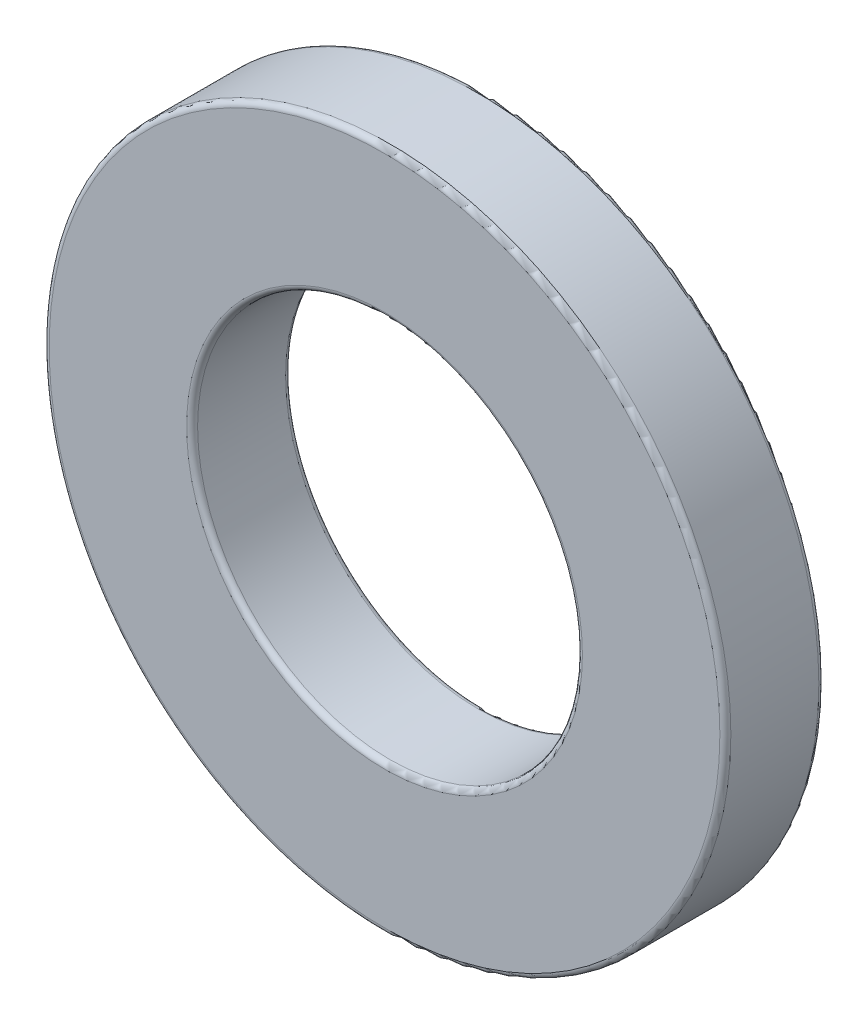
ISO-10303-21;
HEADER;
FILE_DESCRIPTION(('STEP AP214'),'2;1');
FILE_NAME('part.step','',(''),(''),'','','');
FILE_SCHEMA(('AUTOMOTIVE_DESIGN { 1 0 10303 214 1 1 1 1 }'));
ENDSEC;
DATA;
#1=APPLICATION_CONTEXT('core data for automotive mechanical design processes');
#2=APPLICATION_PROTOCOL_DEFINITION('international standard','automotive_design',2000,#1);
#3=PRODUCT_CONTEXT('',#1,'mechanical');
#4=PRODUCT('Part','Part','',(#3));
#5=PRODUCT_RELATED_PRODUCT_CATEGORY('part','',(#4));
#6=PRODUCT_DEFINITION_FORMATION('','',#4);
#7=PRODUCT_DEFINITION_CONTEXT('part definition',#1,'design');
#8=PRODUCT_DEFINITION('design','',#6,#7);
#9=PRODUCT_DEFINITION_SHAPE('','',#8);
#10=(LENGTH_UNIT() NAMED_UNIT(*) SI_UNIT(.MILLI.,.METRE.));
#11=(NAMED_UNIT(*) PLANE_ANGLE_UNIT() SI_UNIT($,.RADIAN.));
#12=(NAMED_UNIT(*) SI_UNIT($,.STERADIAN.) SOLID_ANGLE_UNIT());
#13=UNCERTAINTY_MEASURE_WITH_UNIT(LENGTH_MEASURE(1.E-05),#10,'distance_accuracy_value','');
#14=(GEOMETRIC_REPRESENTATION_CONTEXT(3) GLOBAL_UNCERTAINTY_ASSIGNED_CONTEXT((#13)) GLOBAL_UNIT_ASSIGNED_CONTEXT((#10,
#11,#12)) REPRESENTATION_CONTEXT('',''));
#15=CARTESIAN_POINT('',(0.,0.,0.));
#16=DIRECTION('',(0.,0.,1.));
#17=DIRECTION('',(1.,0.,0.));
#18=AXIS2_PLACEMENT_3D('',#15,#16,#17);
#19=CARTESIAN_POINT('',(0.,0.,9.));
#20=DIRECTION('',(0.,0.,1.));
#21=DIRECTION('',(1.,0.,0.));
#22=AXIS2_PLACEMENT_3D('',#19,#20,#21);
#23=PLANE('',#22);
#24=CARTESIAN_POINT('',(0.,0.,9.));
#25=DIRECTION('',(0.,0.,1.));
#26=DIRECTION('',(1.,0.,0.));
#27=AXIS2_PLACEMENT_3D('',#24,#25,#26);
#28=CIRCLE('',#27,30.5);
#29=CARTESIAN_POINT('',(30.5,0.,9.));
#30=VERTEX_POINT('',#29);
#31=EDGE_CURVE('E39',#30,#30,#28,.T.);
#32=ORIENTED_EDGE('',*,*,#31,.T.);
#33=EDGE_LOOP('',(#32));
#34=FACE_BOUND('',#33,.T.);
#35=CARTESIAN_POINT('',(0.,0.,9.));
#36=DIRECTION('',(0.,0.,1.));
#37=DIRECTION('',(1.,0.,0.));
#38=AXIS2_PLACEMENT_3D('',#35,#36,#37);
#39=CIRCLE('',#38,18.);
#40=CARTESIAN_POINT('',(18.,0.,9.));
#41=VERTEX_POINT('',#40);
#42=EDGE_CURVE('E43',#41,#41,#39,.F.);
#43=ORIENTED_EDGE('',*,*,#42,.T.);
#44=EDGE_LOOP('',(#43));
#45=FACE_BOUND('',#44,.T.);
#46=ADVANCED_FACE('F28',(#34,#45),#23,.T.);
#47=CARTESIAN_POINT('',(0.,0.,0.));
#48=DIRECTION('',(0.,0.,1.));
#49=DIRECTION('',(1.,0.,0.));
#50=AXIS2_PLACEMENT_3D('',#47,#48,#49);
#51=PLANE('',#50);
#52=CARTESIAN_POINT('',(0.,0.,0.));
#53=DIRECTION('',(0.,0.,1.));
#54=DIRECTION('',(1.,0.,0.));
#55=AXIS2_PLACEMENT_3D('',#52,#53,#54);
#56=CIRCLE('',#55,30.5);
#57=CARTESIAN_POINT('',(30.5,0.,0.));
#58=VERTEX_POINT('',#57);
#59=EDGE_CURVE('E48',#58,#58,#56,.F.);
#60=ORIENTED_EDGE('',*,*,#59,.T.);
#61=EDGE_LOOP('',(#60));
#62=FACE_BOUND('',#61,.T.);
#63=CARTESIAN_POINT('',(0.,0.,0.));
#64=DIRECTION('',(0.,0.,1.));
#65=DIRECTION('',(1.,0.,0.));
#66=AXIS2_PLACEMENT_3D('',#63,#64,#65);
#67=CIRCLE('',#66,18.);
#68=CARTESIAN_POINT('',(18.,0.,0.));
#69=VERTEX_POINT('',#68);
#70=EDGE_CURVE('E51',#69,#69,#67,.T.);
#71=ORIENTED_EDGE('',*,*,#70,.T.);
#72=EDGE_LOOP('',(#71));
#73=FACE_BOUND('',#72,.T.);
#74=ADVANCED_FACE('F73',(#62,#73),#51,.F.);
#75=CARTESIAN_POINT('',(0.,0.,9.));
#76=DIRECTION('',(0.,0.,-1.));
#77=DIRECTION('',(-1.,0.,0.));
#78=AXIS2_PLACEMENT_3D('',#75,#76,#77);
#79=CYLINDRICAL_SURFACE('',#78,31.);
#80=CARTESIAN_POINT('',(0.,0.,0.5));
#81=DIRECTION('',(0.,0.,1.));
#82=DIRECTION('',(1.,0.,0.));
#83=AXIS2_PLACEMENT_3D('',#80,#81,#82);
#84=CIRCLE('',#83,31.);
#85=CARTESIAN_POINT('',(31.,0.,0.5));
#86=VERTEX_POINT('',#85);
#87=EDGE_CURVE('E54',#86,#86,#84,.T.);
#88=ORIENTED_EDGE('',*,*,#87,.T.);
#89=EDGE_LOOP('',(#88));
#90=FACE_BOUND('',#89,.T.);
#91=CARTESIAN_POINT('',(0.,0.,8.5));
#92=DIRECTION('',(0.,0.,1.));
#93=DIRECTION('',(1.,0.,0.));
#94=AXIS2_PLACEMENT_3D('',#91,#92,#93);
#95=CIRCLE('',#94,31.);
#96=CARTESIAN_POINT('',(31.,0.,8.5));
#97=VERTEX_POINT('',#96);
#98=EDGE_CURVE('E57',#97,#97,#95,.F.);
#99=ORIENTED_EDGE('',*,*,#98,.T.);
#100=EDGE_LOOP('',(#99));
#101=FACE_BOUND('',#100,.T.);
#102=ADVANCED_FACE('F61',(#90,#101),#79,.T.);
#103=CARTESIAN_POINT('',(0.,0.,9.));
#104=DIRECTION('',(0.,0.,-1.));
#105=DIRECTION('',(-1.,0.,0.));
#106=AXIS2_PLACEMENT_3D('',#103,#104,#105);
#107=CYLINDRICAL_SURFACE('',#106,17.5);
#108=CARTESIAN_POINT('',(0.,0.,0.5));
#109=DIRECTION('',(0.,0.,1.));
#110=DIRECTION('',(1.,0.,0.));
#111=AXIS2_PLACEMENT_3D('',#108,#109,#110);
#112=CIRCLE('',#111,17.5);
#113=CARTESIAN_POINT('',(17.5,0.,0.5));
#114=VERTEX_POINT('',#113);
#115=EDGE_CURVE('E10',#114,#114,#112,.F.);
#116=ORIENTED_EDGE('',*,*,#115,.T.);
#117=EDGE_LOOP('',(#116));
#118=FACE_BOUND('',#117,.T.);
#119=CARTESIAN_POINT('',(0.,0.,8.5));
#120=DIRECTION('',(0.,0.,1.));
#121=DIRECTION('',(1.,0.,0.));
#122=AXIS2_PLACEMENT_3D('',#119,#120,#121);
#123=CIRCLE('',#122,17.5);
#124=CARTESIAN_POINT('',(17.5,0.,8.5));
#125=VERTEX_POINT('',#124);
#126=EDGE_CURVE('E35',#125,#125,#123,.T.);
#127=ORIENTED_EDGE('',*,*,#126,.T.);
#128=EDGE_LOOP('',(#127));
#129=FACE_BOUND('',#128,.T.);
#130=ADVANCED_FACE('F89',(#118,#129),#107,.F.);
#131=CARTESIAN_POINT('',(0.,0.,0.5));
#132=DIRECTION('',(0.,0.,1.));
#133=DIRECTION('',(1.,0.,0.));
#134=AXIS2_PLACEMENT_3D('',#131,#132,#133);
#135=TOROIDAL_SURFACE('',#134,30.5,0.5);
#136=ORIENTED_EDGE('',*,*,#59,.F.);
#137=EDGE_LOOP('',(#136));
#138=FACE_BOUND('',#137,.T.);
#139=ORIENTED_EDGE('',*,*,#87,.F.);
#140=EDGE_LOOP('',(#139));
#141=FACE_BOUND('',#140,.T.);
#142=ADVANCED_FACE('F67',(#138,#141),#135,.T.);
#143=CARTESIAN_POINT('',(0.,0.,8.5));
#144=DIRECTION('',(0.,0.,1.));
#145=DIRECTION('',(1.,0.,0.));
#146=AXIS2_PLACEMENT_3D('',#143,#144,#145);
#147=TOROIDAL_SURFACE('',#146,30.5,0.5);
#148=ORIENTED_EDGE('',*,*,#98,.F.);
#149=EDGE_LOOP('',(#148));
#150=FACE_BOUND('',#149,.T.);
#151=ORIENTED_EDGE('',*,*,#31,.F.);
#152=EDGE_LOOP('',(#151));
#153=FACE_BOUND('',#152,.T.);
#154=ADVANCED_FACE('F63',(#150,#153),#147,.T.);
#155=CARTESIAN_POINT('',(0.,0.,0.5));
#156=DIRECTION('',(0.,0.,1.));
#157=DIRECTION('',(1.,0.,0.));
#158=AXIS2_PLACEMENT_3D('',#155,#156,#157);
#159=TOROIDAL_SURFACE('',#158,18.,0.5);
#160=ORIENTED_EDGE('',*,*,#115,.F.);
#161=EDGE_LOOP('',(#160));
#162=FACE_BOUND('',#161,.T.);
#163=ORIENTED_EDGE('',*,*,#70,.F.);
#164=EDGE_LOOP('',(#163));
#165=FACE_BOUND('',#164,.T.);
#166=ADVANCED_FACE('F66',(#162,#165),#159,.T.);
#167=CARTESIAN_POINT('',(0.,0.,8.5));
#168=DIRECTION('',(0.,0.,1.));
#169=DIRECTION('',(1.,0.,0.));
#170=AXIS2_PLACEMENT_3D('',#167,#168,#169);
#171=TOROIDAL_SURFACE('',#170,18.,0.5);
#172=ORIENTED_EDGE('',*,*,#42,.F.);
#173=EDGE_LOOP('',(#172));
#174=FACE_BOUND('',#173,.T.);
#175=ORIENTED_EDGE('',*,*,#126,.F.);
#176=EDGE_LOOP('',(#175));
#177=FACE_BOUND('',#176,.T.);
#178=ADVANCED_FACE('F30',(#174,#177),#171,.T.);
#179=CLOSED_SHELL('',(#46,#74,#102,#130,#142,#154,#166,#178));
#180=MANIFOLD_SOLID_BREP('B2',#179);
#181=ADVANCED_BREP_SHAPE_REPRESENTATION('',(#18,#180),#14);
#182=SHAPE_DEFINITION_REPRESENTATION(#9,#181);
ENDSEC;
END-ISO-10303-21;
